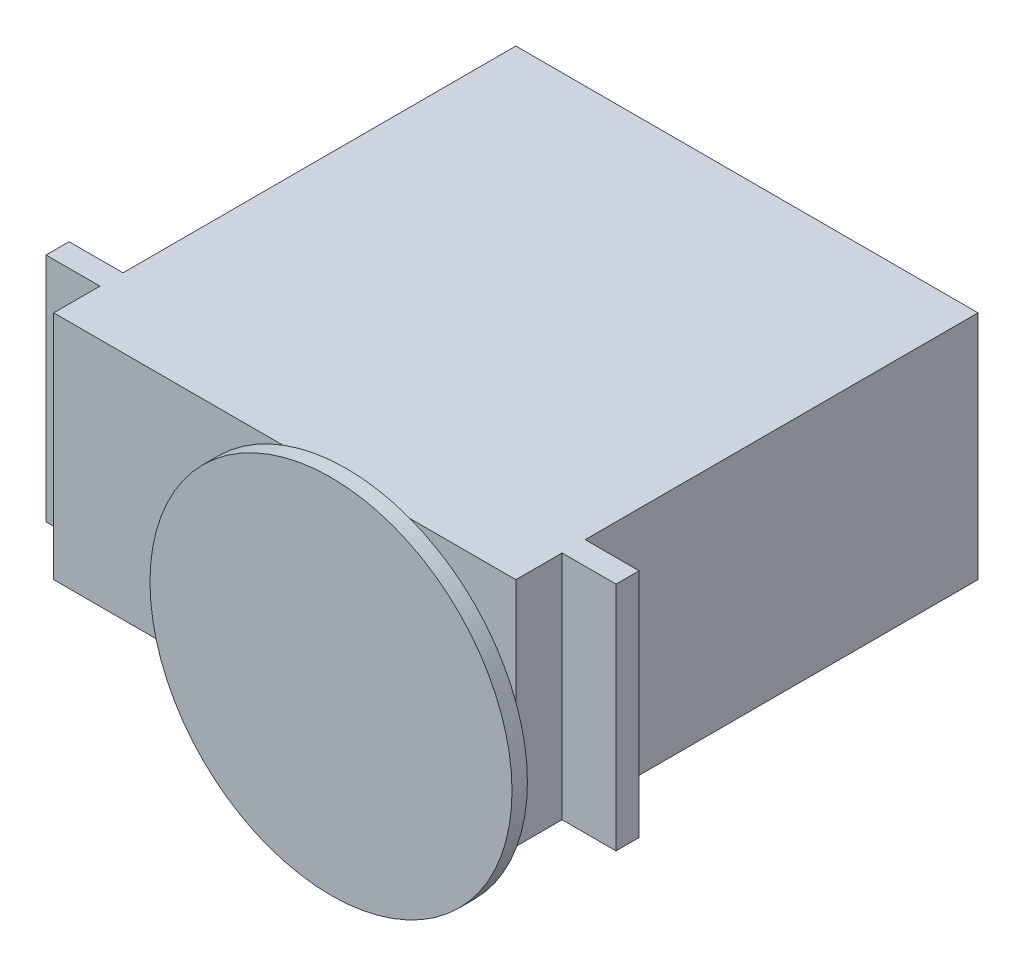
ISO-10303-21;
HEADER;
FILE_DESCRIPTION(('STEP AP214'),'2;1');
FILE_NAME('part.step','',(''),(''),'','','');
FILE_SCHEMA(('AUTOMOTIVE_DESIGN { 1 0 10303 214 1 1 1 1 }'));
ENDSEC;
DATA;
#1=APPLICATION_CONTEXT('core data for automotive mechanical design processes');
#2=APPLICATION_PROTOCOL_DEFINITION('international standard','automotive_design',2000,#1);
#3=PRODUCT_CONTEXT('',#1,'mechanical');
#4=PRODUCT('Part','Part','',(#3));
#5=PRODUCT_RELATED_PRODUCT_CATEGORY('part','',(#4));
#6=PRODUCT_DEFINITION_FORMATION('','',#4);
#7=PRODUCT_DEFINITION_CONTEXT('part definition',#1,'design');
#8=PRODUCT_DEFINITION('design','',#6,#7);
#9=PRODUCT_DEFINITION_SHAPE('','',#8);
#10=(LENGTH_UNIT() NAMED_UNIT(*) SI_UNIT(.MILLI.,.METRE.));
#11=(NAMED_UNIT(*) PLANE_ANGLE_UNIT() SI_UNIT($,.RADIAN.));
#12=(NAMED_UNIT(*) SI_UNIT($,.STERADIAN.) SOLID_ANGLE_UNIT());
#13=UNCERTAINTY_MEASURE_WITH_UNIT(LENGTH_MEASURE(1.E-05),#10,'distance_accuracy_value','');
#14=(GEOMETRIC_REPRESENTATION_CONTEXT(3) GLOBAL_UNCERTAINTY_ASSIGNED_CONTEXT((#13)) GLOBAL_UNIT_ASSIGNED_CONTEXT((#10,
#11,#12)) REPRESENTATION_CONTEXT('',''));
#15=CARTESIAN_POINT('',(0.,0.,0.));
#16=DIRECTION('',(0.,0.,1.));
#17=DIRECTION('',(1.,0.,0.));
#18=AXIS2_PLACEMENT_3D('',#15,#16,#17);
#19=CARTESIAN_POINT('',(30.,30.0000000000007,-30.0000000000007));
#20=DIRECTION('',(-1.,0.,0.));
#21=DIRECTION('',(0.,0.,1.00000000000001));
#22=AXIS2_PLACEMENT_3D('',#19,#20,#21);
#23=PLANE('',#22);
#24=DIRECTION('',(0.,0.,-1.00000000000001));
#25=VECTOR('',#24,1.);
#26=CARTESIAN_POINT('',(30.,2.22044604925031E-13,-30.0000000000006));
#27=LINE('',#26,#25);
#28=CARTESIAN_POINT('',(30.,4.44089209850063E-13,29.9999999999999));
#29=VERTEX_POINT('',#28);
#30=CARTESIAN_POINT('',(30.,2.77555756156289E-13,23.9999999999998));
#31=VERTEX_POINT('',#30);
#32=EDGE_CURVE('E207',#29,#31,#27,.T.);
#33=ORIENTED_EDGE('',*,*,#32,.T.);
#34=DIRECTION('',(0.,1.00000000000001,0.));
#35=VECTOR('',#34,1.);
#36=CARTESIAN_POINT('',(30.,30.0000000000006,23.9999999999998));
#37=LINE('',#36,#35);
#38=CARTESIAN_POINT('',(30.,30.0000000000006,23.9999999999998));
#39=VERTEX_POINT('',#38);
#40=EDGE_CURVE('E132',#31,#39,#37,.T.);
#41=ORIENTED_EDGE('',*,*,#40,.T.);
#42=DIRECTION('',(0.,0.,-1.00000000000001));
#43=VECTOR('',#42,1.);
#44=CARTESIAN_POINT('',(30.,30.0000000000007,-30.0000000000007));
#45=LINE('',#44,#43);
#46=CARTESIAN_POINT('',(30.,30.0000000000006,29.9999999999998));
#47=VERTEX_POINT('',#46);
#48=EDGE_CURVE('E196',#47,#39,#45,.T.);
#49=ORIENTED_EDGE('',*,*,#48,.F.);
#50=DIRECTION('',(0.,-1.00000000000001,0.));
#51=VECTOR('',#50,1.);
#52=CARTESIAN_POINT('',(30.,30.0000000000006,29.9999999999998));
#53=LINE('',#52,#51);
#54=EDGE_CURVE('E206',#47,#29,#53,.T.);
#55=ORIENTED_EDGE('',*,*,#54,.T.);
#56=EDGE_LOOP('',(#33,#41,#49,#55));
#57=FACE_BOUND('',#56,.T.);
#58=ADVANCED_FACE('F34',(#57),#23,.F.);
#59=CARTESIAN_POINT('',(-30.,30.0000000000002,-30.0000000000003));
#60=DIRECTION('',(1.,0.,0.));
#61=DIRECTION('',(0.,0.,-1.00000000000001));
#62=AXIS2_PLACEMENT_3D('',#59,#60,#61);
#63=PLANE('',#62);
#64=DIRECTION('',(0.,0.,1.00000000000001));
#65=VECTOR('',#64,1.);
#66=CARTESIAN_POINT('',(-30.,30.0000000000002,-30.0000000000003));
#67=LINE('',#66,#65);
#68=CARTESIAN_POINT('',(-30.,30.0000000000001,23.9999999999998));
#69=VERTEX_POINT('',#68);
#70=CARTESIAN_POINT('',(-30.,30.0000000000002,29.9999999999997));
#71=VERTEX_POINT('',#70);
#72=EDGE_CURVE('E49',#69,#71,#67,.T.);
#73=ORIENTED_EDGE('',*,*,#72,.F.);
#74=DIRECTION('',(0.,-1.00000000000001,0.));
#75=VECTOR('',#74,1.);
#76=CARTESIAN_POINT('',(-30.,30.0000000000001,23.9999999999998));
#77=LINE('',#76,#75);
#78=CARTESIAN_POINT('',(-30.,0.,23.9999999999999));
#79=VERTEX_POINT('',#78);
#80=EDGE_CURVE('E183',#69,#79,#77,.T.);
#81=ORIENTED_EDGE('',*,*,#80,.T.);
#82=DIRECTION('',(0.,0.,1.00000000000001));
#83=VECTOR('',#82,1.);
#84=CARTESIAN_POINT('',(-30.,2.22044604925031E-13,-30.0000000000006));
#85=LINE('',#84,#83);
#86=CARTESIAN_POINT('',(-30.,0.,30.));
#87=VERTEX_POINT('',#86);
#88=EDGE_CURVE('E211',#79,#87,#85,.T.);
#89=ORIENTED_EDGE('',*,*,#88,.T.);
#90=DIRECTION('',(0.,-1.00000000000001,0.));
#91=VECTOR('',#90,1.);
#92=CARTESIAN_POINT('',(-30.,30.0000000000002,29.9999999999997));
#93=LINE('',#92,#91);
#94=EDGE_CURVE('E218',#71,#87,#93,.T.);
#95=ORIENTED_EDGE('',*,*,#94,.F.);
#96=EDGE_LOOP('',(#73,#81,#89,#95));
#97=FACE_BOUND('',#96,.T.);
#98=ADVANCED_FACE('F256',(#97),#63,.F.);
#99=CARTESIAN_POINT('',(-30.,30.0000000000002,29.9999999999997));
#100=DIRECTION('',(0.,0.,-1.00000000000001));
#101=DIRECTION('',(-1.,0.,0.));
#102=AXIS2_PLACEMENT_3D('',#99,#100,#101);
#103=PLANE('',#102);
#104=DIRECTION('',(1.,0.,0.));
#105=VECTOR('',#104,1.);
#106=CARTESIAN_POINT('',(-30.,0.,30.));
#107=LINE('',#106,#105);
#108=EDGE_CURVE('E214',#87,#29,#107,.T.);
#109=ORIENTED_EDGE('',*,*,#108,.T.);
#110=ORIENTED_EDGE('',*,*,#54,.F.);
#111=DIRECTION('',(1.,0.,0.));
#112=VECTOR('',#111,1.);
#113=CARTESIAN_POINT('',(-30.,30.0000000000002,29.9999999999997));
#114=LINE('',#113,#112);
#115=EDGE_CURVE('E204',#71,#47,#114,.T.);
#116=ORIENTED_EDGE('',*,*,#115,.F.);
#117=ORIENTED_EDGE('',*,*,#94,.T.);
#118=EDGE_LOOP('',(#109,#110,#116,#117));
#119=FACE_BOUND('',#118,.T.);
#120=CARTESIAN_POINT('',(15.,15.0000000000004,29.9999999999998));
#121=DIRECTION('',(0.,0.,-1.00000000000001));
#122=DIRECTION('',(-1.,0.,0.));
#123=AXIS2_PLACEMENT_3D('',#120,#121,#122);
#124=CIRCLE('',#123,3.5);
#125=CARTESIAN_POINT('',(11.5,15.0000000000004,29.9999999999998));
#126=VERTEX_POINT('',#125);
#127=EDGE_CURVE('E11',#126,#126,#124,.F.);
#128=ORIENTED_EDGE('',*,*,#127,.F.);
#129=EDGE_LOOP('',(#128));
#130=FACE_BOUND('',#129,.T.);
#131=ADVANCED_FACE('F261',(#119,#130),#103,.F.);
#132=CARTESIAN_POINT('',(30.,30.0000000000005,20.9999999999998));
#133=VERTEX_POINT('',#132);
#134=CARTESIAN_POINT('',(30.,30.0000000000007,-30.0000000000007));
#135=VERTEX_POINT('',#134);
#136=EDGE_CURVE('E200',#133,#135,#45,.T.);
#137=ORIENTED_EDGE('',*,*,#136,.F.);
#138=DIRECTION('',(0.,-1.00000000000001,0.));
#139=VECTOR('',#138,1.);
#140=CARTESIAN_POINT('',(30.,30.0000000000005,20.9999999999998));
#141=LINE('',#140,#139);
#142=CARTESIAN_POINT('',(30.,1.66533453693773E-13,20.9999999999999));
#143=VERTEX_POINT('',#142);
#144=EDGE_CURVE('E180',#133,#143,#141,.T.);
#145=ORIENTED_EDGE('',*,*,#144,.T.);
#146=CARTESIAN_POINT('',(30.,2.22044604925031E-13,-30.0000000000006));
#147=VERTEX_POINT('',#146);
#148=EDGE_CURVE('E195',#143,#147,#27,.T.);
#149=ORIENTED_EDGE('',*,*,#148,.T.);
#150=DIRECTION('',(0.,-1.00000000000001,0.));
#151=VECTOR('',#150,1.);
#152=CARTESIAN_POINT('',(30.,30.0000000000007,-30.0000000000007));
#153=LINE('',#152,#151);
#154=EDGE_CURVE('E42',#135,#147,#153,.T.);
#155=ORIENTED_EDGE('',*,*,#154,.F.);
#156=EDGE_LOOP('',(#137,#145,#149,#155));
#157=FACE_BOUND('',#156,.T.);
#158=ADVANCED_FACE('F36',(#157),#23,.F.);
#159=CARTESIAN_POINT('',(-30.,30.0000000000002,-30.0000000000003));
#160=DIRECTION('',(0.,0.,1.00000000000001));
#161=DIRECTION('',(1.,0.,0.));
#162=AXIS2_PLACEMENT_3D('',#159,#160,#161);
#163=PLANE('',#162);
#164=DIRECTION('',(-1.,0.,0.));
#165=VECTOR('',#164,1.);
#166=CARTESIAN_POINT('',(-30.,2.22044604925031E-13,-30.0000000000006));
#167=LINE('',#166,#165);
#168=CARTESIAN_POINT('',(-30.,2.22044604925031E-13,-30.0000000000006));
#169=VERTEX_POINT('',#168);
#170=EDGE_CURVE('E209',#147,#169,#167,.T.);
#171=ORIENTED_EDGE('',*,*,#170,.T.);
#172=DIRECTION('',(0.,-1.00000000000001,0.));
#173=VECTOR('',#172,1.);
#174=CARTESIAN_POINT('',(-30.,30.0000000000002,-30.0000000000003));
#175=LINE('',#174,#173);
#176=CARTESIAN_POINT('',(-30.,30.0000000000002,-30.0000000000003));
#177=VERTEX_POINT('',#176);
#178=EDGE_CURVE('E221',#177,#169,#175,.T.);
#179=ORIENTED_EDGE('',*,*,#178,.F.);
#180=DIRECTION('',(-1.,0.,0.));
#181=VECTOR('',#180,1.);
#182=CARTESIAN_POINT('',(-30.,30.0000000000002,-30.0000000000003));
#183=LINE('',#182,#181);
#184=EDGE_CURVE('E199',#135,#177,#183,.T.);
#185=ORIENTED_EDGE('',*,*,#184,.F.);
#186=ORIENTED_EDGE('',*,*,#154,.T.);
#187=EDGE_LOOP('',(#171,#179,#185,#186));
#188=FACE_BOUND('',#187,.T.);
#189=ADVANCED_FACE('F227',(#188),#163,.F.);
#190=CARTESIAN_POINT('',(-30.,0.,21.));
#191=VERTEX_POINT('',#190);
#192=EDGE_CURVE('E212',#169,#191,#85,.T.);
#193=ORIENTED_EDGE('',*,*,#192,.T.);
#194=DIRECTION('',(0.,1.00000000000001,0.));
#195=VECTOR('',#194,1.);
#196=CARTESIAN_POINT('',(-30.,30.0000000000002,21.));
#197=LINE('',#196,#195);
#198=CARTESIAN_POINT('',(-30.,30.0000000000002,21.));
#199=VERTEX_POINT('',#198);
#200=EDGE_CURVE('E57',#191,#199,#197,.T.);
#201=ORIENTED_EDGE('',*,*,#200,.T.);
#202=EDGE_CURVE('E202',#177,#199,#67,.T.);
#203=ORIENTED_EDGE('',*,*,#202,.F.);
#204=ORIENTED_EDGE('',*,*,#178,.T.);
#205=EDGE_LOOP('',(#193,#201,#203,#204));
#206=FACE_BOUND('',#205,.T.);
#207=ADVANCED_FACE('F233',(#206),#63,.F.);
#208=CARTESIAN_POINT('',(0.,30.0000000000002,-2.4980018054066E-13));
#209=DIRECTION('',(0.,1.00000000000001,0.));
#210=DIRECTION('',(0.,0.,1.00000000000001));
#211=AXIS2_PLACEMENT_3D('',#208,#209,#210);
#212=PLANE('',#211);
#213=ORIENTED_EDGE('',*,*,#202,.T.);
#214=DIRECTION('',(1.,0.,0.));
#215=VECTOR('',#214,1.);
#216=CARTESIAN_POINT('',(-37.,30.0000000000002,21.));
#217=LINE('',#216,#215);
#218=CARTESIAN_POINT('',(-37.,30.0000000000002,21.));
#219=VERTEX_POINT('',#218);
#220=EDGE_CURVE('E171',#219,#199,#217,.T.);
#221=ORIENTED_EDGE('',*,*,#220,.F.);
#222=DIRECTION('',(0.,0.,1.00000000000001));
#223=VECTOR('',#222,1.);
#224=CARTESIAN_POINT('',(-37.,30.0000000000001,23.9999999999998));
#225=LINE('',#224,#223);
#226=CARTESIAN_POINT('',(-37.,30.0000000000001,23.9999999999998));
#227=VERTEX_POINT('',#226);
#228=EDGE_CURVE('E136',#219,#227,#225,.T.);
#229=ORIENTED_EDGE('',*,*,#228,.T.);
#230=DIRECTION('',(1.,0.,0.));
#231=VECTOR('',#230,1.);
#232=CARTESIAN_POINT('',(-37.,30.0000000000001,23.9999999999998));
#233=LINE('',#232,#231);
#234=EDGE_CURVE('E167',#227,#69,#233,.T.);
#235=ORIENTED_EDGE('',*,*,#234,.T.);
#236=ORIENTED_EDGE('',*,*,#72,.T.);
#237=ORIENTED_EDGE('',*,*,#115,.T.);
#238=ORIENTED_EDGE('',*,*,#48,.T.);
#239=CARTESIAN_POINT('',(37.,30.0000000000006,23.9999999999998));
#240=VERTEX_POINT('',#239);
#241=EDGE_CURVE('E170',#39,#240,#233,.T.);
#242=ORIENTED_EDGE('',*,*,#241,.T.);
#243=DIRECTION('',(0.,0.,1.00000000000001));
#244=VECTOR('',#243,1.);
#245=CARTESIAN_POINT('',(37.,30.0000000000006,23.9999999999998));
#246=LINE('',#245,#244);
#247=CARTESIAN_POINT('',(37.,30.0000000000005,20.9999999999998));
#248=VERTEX_POINT('',#247);
#249=EDGE_CURVE('E151',#248,#240,#246,.T.);
#250=ORIENTED_EDGE('',*,*,#249,.F.);
#251=EDGE_CURVE('E174',#133,#248,#217,.T.);
#252=ORIENTED_EDGE('',*,*,#251,.F.);
#253=ORIENTED_EDGE('',*,*,#136,.T.);
#254=ORIENTED_EDGE('',*,*,#184,.T.);
#255=EDGE_LOOP('',(#213,#221,#229,#235,#236,#237,#238,#242,#250,#252,#253,#254));
#256=FACE_BOUND('',#255,.T.);
#257=ADVANCED_FACE('F239',(#256),#212,.T.);
#258=CARTESIAN_POINT('',(0.,0.,0.));
#259=DIRECTION('',(0.,1.00000000000001,0.));
#260=DIRECTION('',(0.,0.,1.00000000000001));
#261=AXIS2_PLACEMENT_3D('',#258,#259,#260);
#262=PLANE('',#261);
#263=ORIENTED_EDGE('',*,*,#148,.F.);
#264=DIRECTION('',(1.,0.,0.));
#265=VECTOR('',#264,1.);
#266=CARTESIAN_POINT('',(-37.,0.,21.));
#267=LINE('',#266,#265);
#268=CARTESIAN_POINT('',(37.,1.66533453693773E-13,20.9999999999999));
#269=VERTEX_POINT('',#268);
#270=EDGE_CURVE('E142',#143,#269,#267,.T.);
#271=ORIENTED_EDGE('',*,*,#270,.T.);
#272=DIRECTION('',(0.,0.,-1.00000000000001));
#273=VECTOR('',#272,1.);
#274=CARTESIAN_POINT('',(37.,2.77555756156289E-13,23.9999999999999));
#275=LINE('',#274,#273);
#276=CARTESIAN_POINT('',(37.,2.77555756156289E-13,23.9999999999999));
#277=VERTEX_POINT('',#276);
#278=EDGE_CURVE('E139',#277,#269,#275,.T.);
#279=ORIENTED_EDGE('',*,*,#278,.F.);
#280=DIRECTION('',(1.,0.,0.));
#281=VECTOR('',#280,1.);
#282=CARTESIAN_POINT('',(-37.,0.,23.9999999999999));
#283=LINE('',#282,#281);
#284=EDGE_CURVE('E126',#31,#277,#283,.T.);
#285=ORIENTED_EDGE('',*,*,#284,.F.);
#286=ORIENTED_EDGE('',*,*,#32,.F.);
#287=ORIENTED_EDGE('',*,*,#108,.F.);
#288=ORIENTED_EDGE('',*,*,#88,.F.);
#289=CARTESIAN_POINT('',(-37.,0.,23.9999999999999));
#290=VERTEX_POINT('',#289);
#291=EDGE_CURVE('E135',#290,#79,#283,.T.);
#292=ORIENTED_EDGE('',*,*,#291,.F.);
#293=DIRECTION('',(0.,0.,-1.00000000000001));
#294=VECTOR('',#293,1.);
#295=CARTESIAN_POINT('',(-37.,0.,23.9999999999999));
#296=LINE('',#295,#294);
#297=CARTESIAN_POINT('',(-37.,0.,21.));
#298=VERTEX_POINT('',#297);
#299=EDGE_CURVE('E159',#290,#298,#296,.T.);
#300=ORIENTED_EDGE('',*,*,#299,.T.);
#301=EDGE_CURVE('E175',#298,#191,#267,.T.);
#302=ORIENTED_EDGE('',*,*,#301,.T.);
#303=ORIENTED_EDGE('',*,*,#192,.F.);
#304=ORIENTED_EDGE('',*,*,#170,.F.);
#305=EDGE_LOOP('',(#263,#271,#279,#285,#286,#287,#288,#292,#300,#302,#303,#304));
#306=FACE_BOUND('',#305,.T.);
#307=ADVANCED_FACE('F140',(#306),#262,.F.);
#308=CARTESIAN_POINT('',(15.,15.0000000000005,36.9999999999998));
#309=DIRECTION('',(0.,0.,-1.00000000000001));
#310=DIRECTION('',(-1.,0.,0.));
#311=AXIS2_PLACEMENT_3D('',#308,#309,#310);
#312=CYLINDRICAL_SURFACE('',#311,3.5);
#313=CARTESIAN_POINT('',(15.,15.0000000000005,36.9999999999998));
#314=DIRECTION('',(0.,0.,1.00000000000001));
#315=DIRECTION('',(1.,0.,0.));
#316=AXIS2_PLACEMENT_3D('',#313,#314,#315);
#317=CIRCLE('',#316,3.5);
#318=CARTESIAN_POINT('',(18.5,15.0000000000005,36.9999999999998));
#319=VERTEX_POINT('',#318);
#320=EDGE_CURVE('E190',#319,#319,#317,.T.);
#321=ORIENTED_EDGE('',*,*,#320,.F.);
#322=EDGE_LOOP('',(#321));
#323=FACE_BOUND('',#322,.T.);
#324=ORIENTED_EDGE('',*,*,#127,.T.);
#325=EDGE_LOOP('',(#324));
#326=FACE_BOUND('',#325,.T.);
#327=ADVANCED_FACE('F282',(#323,#326),#312,.T.);
#328=CARTESIAN_POINT('',(15.,15.0000000000005,36.9999999999998));
#329=DIRECTION('',(0.,0.,1.00000000000001));
#330=DIRECTION('',(1.,0.,0.));
#331=AXIS2_PLACEMENT_3D('',#328,#329,#330);
#332=PLANE('',#331);
#333=CARTESIAN_POINT('',(15.,15.0000000000005,36.9999999999998));
#334=DIRECTION('',(0.,0.,1.00000000000001));
#335=DIRECTION('',(1.,0.,0.));
#336=AXIS2_PLACEMENT_3D('',#333,#334,#335);
#337=CIRCLE('',#336,23.5);
#338=CARTESIAN_POINT('',(38.5,15.0000000000005,36.9999999999998));
#339=VERTEX_POINT('',#338);
#340=EDGE_CURVE('E186',#339,#339,#337,.T.);
#341=ORIENTED_EDGE('',*,*,#340,.F.);
#342=EDGE_LOOP('',(#341));
#343=FACE_BOUND('',#342,.T.);
#344=ORIENTED_EDGE('',*,*,#320,.T.);
#345=EDGE_LOOP('',(#344));
#346=FACE_BOUND('',#345,.T.);
#347=ADVANCED_FACE('F286',(#343,#346),#332,.F.);
#348=CARTESIAN_POINT('',(15.,15.0000000000004,39.0000000000001));
#349=DIRECTION('',(0.,0.,-1.00000000000001));
#350=DIRECTION('',(-1.,0.,0.));
#351=AXIS2_PLACEMENT_3D('',#348,#349,#350);
#352=CYLINDRICAL_SURFACE('',#351,23.5);
#353=CARTESIAN_POINT('',(15.,15.0000000000004,39.0000000000001));
#354=DIRECTION('',(0.,0.,1.00000000000001));
#355=DIRECTION('',(1.,0.,0.));
#356=AXIS2_PLACEMENT_3D('',#353,#354,#355);
#357=CIRCLE('',#356,23.5);
#358=CARTESIAN_POINT('',(38.5,15.0000000000004,39.0000000000001));
#359=VERTEX_POINT('',#358);
#360=EDGE_CURVE('E187',#359,#359,#357,.T.);
#361=ORIENTED_EDGE('',*,*,#360,.F.);
#362=EDGE_LOOP('',(#361));
#363=FACE_BOUND('',#362,.T.);
#364=ORIENTED_EDGE('',*,*,#340,.T.);
#365=EDGE_LOOP('',(#364));
#366=FACE_BOUND('',#365,.T.);
#367=ADVANCED_FACE('F288',(#363,#366),#352,.T.);
#368=CARTESIAN_POINT('',(15.,15.0000000000004,39.0000000000001));
#369=DIRECTION('',(0.,0.,1.00000000000001));
#370=DIRECTION('',(1.,0.,0.));
#371=AXIS2_PLACEMENT_3D('',#368,#369,#370);
#372=PLANE('',#371);
#373=ORIENTED_EDGE('',*,*,#360,.T.);
#374=EDGE_LOOP('',(#373));
#375=FACE_BOUND('',#374,.T.);
#376=ADVANCED_FACE('F291',(#375),#372,.T.);
#377=CARTESIAN_POINT('',(-37.,0.,0.));
#378=DIRECTION('',(1.,0.,0.));
#379=DIRECTION('',(0.,0.,-1.00000000000001));
#380=AXIS2_PLACEMENT_3D('',#377,#378,#379);
#381=PLANE('',#380);
#382=DIRECTION('',(0.,-1.00000000000001,0.));
#383=VECTOR('',#382,1.);
#384=CARTESIAN_POINT('',(-37.,30.0000000000001,23.9999999999998));
#385=LINE('',#384,#383);
#386=EDGE_CURVE('E156',#227,#290,#385,.T.);
#387=ORIENTED_EDGE('',*,*,#386,.F.);
#388=ORIENTED_EDGE('',*,*,#228,.F.);
#389=DIRECTION('',(0.,1.00000000000001,0.));
#390=VECTOR('',#389,1.);
#391=CARTESIAN_POINT('',(-37.,30.0000000000002,21.));
#392=LINE('',#391,#390);
#393=EDGE_CURVE('E162',#298,#219,#392,.T.);
#394=ORIENTED_EDGE('',*,*,#393,.F.);
#395=ORIENTED_EDGE('',*,*,#299,.F.);
#396=EDGE_LOOP('',(#387,#388,#394,#395));
#397=FACE_BOUND('',#396,.T.);
#398=ADVANCED_FACE('F254',(#397),#381,.F.);
#399=CARTESIAN_POINT('',(-37.,30.0000000000002,21.));
#400=DIRECTION('',(0.,0.,-1.00000000000001));
#401=DIRECTION('',(-1.,0.,0.));
#402=AXIS2_PLACEMENT_3D('',#399,#400,#401);
#403=PLANE('',#402);
#404=ORIENTED_EDGE('',*,*,#200,.F.);
#405=ORIENTED_EDGE('',*,*,#301,.F.);
#406=ORIENTED_EDGE('',*,*,#393,.T.);
#407=ORIENTED_EDGE('',*,*,#220,.T.);
#408=EDGE_LOOP('',(#404,#405,#406,#407));
#409=FACE_BOUND('',#408,.T.);
#410=ADVANCED_FACE('F235',(#409),#403,.T.);
#411=CARTESIAN_POINT('',(-37.,30.0000000000001,23.9999999999998));
#412=DIRECTION('',(0.,0.,1.00000000000001));
#413=DIRECTION('',(1.,0.,0.));
#414=AXIS2_PLACEMENT_3D('',#411,#412,#413);
#415=PLANE('',#414);
#416=ORIENTED_EDGE('',*,*,#80,.F.);
#417=ORIENTED_EDGE('',*,*,#234,.F.);
#418=ORIENTED_EDGE('',*,*,#386,.T.);
#419=ORIENTED_EDGE('',*,*,#291,.T.);
#420=EDGE_LOOP('',(#416,#417,#418,#419));
#421=FACE_BOUND('',#420,.T.);
#422=ADVANCED_FACE('F250',(#421),#415,.T.);
#423=ORIENTED_EDGE('',*,*,#40,.F.);
#424=ORIENTED_EDGE('',*,*,#284,.T.);
#425=DIRECTION('',(0.,-1.00000000000001,0.));
#426=VECTOR('',#425,1.);
#427=CARTESIAN_POINT('',(37.,30.0000000000006,23.9999999999998));
#428=LINE('',#427,#426);
#429=EDGE_CURVE('E131',#240,#277,#428,.T.);
#430=ORIENTED_EDGE('',*,*,#429,.F.);
#431=ORIENTED_EDGE('',*,*,#241,.F.);
#432=EDGE_LOOP('',(#423,#424,#430,#431));
#433=FACE_BOUND('',#432,.T.);
#434=ADVANCED_FACE('F128',(#433),#415,.T.);
#435=ORIENTED_EDGE('',*,*,#144,.F.);
#436=ORIENTED_EDGE('',*,*,#251,.T.);
#437=DIRECTION('',(0.,1.00000000000001,0.));
#438=VECTOR('',#437,1.);
#439=CARTESIAN_POINT('',(37.,30.0000000000005,20.9999999999998));
#440=LINE('',#439,#438);
#441=EDGE_CURVE('E146',#269,#248,#440,.T.);
#442=ORIENTED_EDGE('',*,*,#441,.F.);
#443=ORIENTED_EDGE('',*,*,#270,.F.);
#444=EDGE_LOOP('',(#435,#436,#442,#443));
#445=FACE_BOUND('',#444,.T.);
#446=ADVANCED_FACE('F242',(#445),#403,.T.);
#447=CARTESIAN_POINT('',(37.,2.77555756156289E-13,-2.4980018054066E-13));
#448=DIRECTION('',(1.,0.,0.));
#449=DIRECTION('',(0.,0.,-1.00000000000001));
#450=AXIS2_PLACEMENT_3D('',#447,#448,#449);
#451=PLANE('',#450);
#452=ORIENTED_EDGE('',*,*,#429,.T.);
#453=ORIENTED_EDGE('',*,*,#278,.T.);
#454=ORIENTED_EDGE('',*,*,#441,.T.);
#455=ORIENTED_EDGE('',*,*,#249,.T.);
#456=EDGE_LOOP('',(#452,#453,#454,#455));
#457=FACE_BOUND('',#456,.T.);
#458=ADVANCED_FACE('F149',(#457),#451,.T.);
#459=CLOSED_SHELL('',(#58,#98,#131,#158,#189,#207,#257,#307,#327,#347,#367,#376,#398,#410,#422,
#434,#446,#458));
#460=MANIFOLD_SOLID_BREP('B2',#459);
#461=ADVANCED_BREP_SHAPE_REPRESENTATION('',(#18,#460),#14);
#462=SHAPE_DEFINITION_REPRESENTATION(#9,#461);
ENDSEC;
END-ISO-10303-21;
